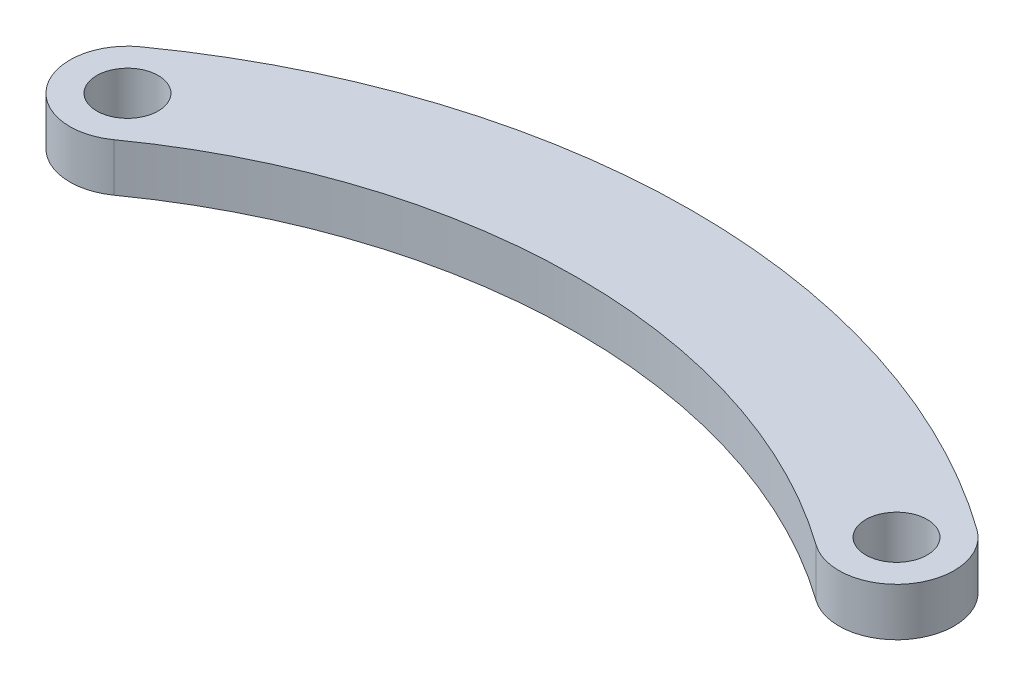
ISO-10303-21;
HEADER;
FILE_DESCRIPTION(('STEP AP214'),'2;1');
FILE_NAME('part.step','',(''),(''),'','','');
FILE_SCHEMA(('AUTOMOTIVE_DESIGN { 1 0 10303 214 1 1 1 1 }'));
ENDSEC;
DATA;
#1=APPLICATION_CONTEXT('core data for automotive mechanical design processes');
#2=APPLICATION_PROTOCOL_DEFINITION('international standard','automotive_design',2000,#1);
#3=PRODUCT_CONTEXT('',#1,'mechanical');
#4=PRODUCT('Part','Part','',(#3));
#5=PRODUCT_RELATED_PRODUCT_CATEGORY('part','',(#4));
#6=PRODUCT_DEFINITION_FORMATION('','',#4);
#7=PRODUCT_DEFINITION_CONTEXT('part definition',#1,'design');
#8=PRODUCT_DEFINITION('design','',#6,#7);
#9=PRODUCT_DEFINITION_SHAPE('','',#8);
#10=(LENGTH_UNIT() NAMED_UNIT(*) SI_UNIT(.MILLI.,.METRE.));
#11=(NAMED_UNIT(*) PLANE_ANGLE_UNIT() SI_UNIT($,.RADIAN.));
#12=(NAMED_UNIT(*) SI_UNIT($,.STERADIAN.) SOLID_ANGLE_UNIT());
#13=UNCERTAINTY_MEASURE_WITH_UNIT(LENGTH_MEASURE(1.E-05),#10,'distance_accuracy_value','');
#14=(GEOMETRIC_REPRESENTATION_CONTEXT(3) GLOBAL_UNCERTAINTY_ASSIGNED_CONTEXT((#13)) GLOBAL_UNIT_ASSIGNED_CONTEXT((#10,
#11,#12)) REPRESENTATION_CONTEXT('',''));
#15=CARTESIAN_POINT('',(0.,0.,0.));
#16=DIRECTION('',(0.,0.,1.));
#17=DIRECTION('',(1.,0.,0.));
#18=AXIS2_PLACEMENT_3D('',#15,#16,#17);
#19=CARTESIAN_POINT('',(30.,2.5,14.0285404331298));
#20=DIRECTION('',(0.,1.,0.));
#21=DIRECTION('',(0.,0.,1.));
#22=AXIS2_PLACEMENT_3D('',#19,#20,#21);
#23=PLANE('',#22);
#24=CARTESIAN_POINT('',(0.,2.5,0.));
#25=DIRECTION('',(0.,1.,0.));
#26=DIRECTION('',(0.,0.,1.));
#27=AXIS2_PLACEMENT_3D('',#24,#25,#26);
#28=CIRCLE('',#27,1.6);
#29=CARTESIAN_POINT('',(0.,2.5,1.6));
#30=VERTEX_POINT('',#29);
#31=EDGE_CURVE('E102',#30,#30,#28,.T.);
#32=ORIENTED_EDGE('',*,*,#31,.F.);
#33=EDGE_LOOP('',(#32));
#34=FACE_BOUND('',#33,.T.);
#35=CARTESIAN_POINT('',(40.,2.5,0.));
#36=DIRECTION('',(0.,1.,0.));
#37=DIRECTION('',(0.,0.,1.));
#38=AXIS2_PLACEMENT_3D('',#35,#36,#37);
#39=CIRCLE('',#38,3.);
#40=CARTESIAN_POINT('',(38.2586368677969,2.5,2.44287831088732));
#41=VERTEX_POINT('',#40);
#42=CARTESIAN_POINT('',(41.7413631322031,2.5,-2.44287831088733));
#43=VERTEX_POINT('',#42);
#44=EDGE_CURVE('E87',#41,#43,#39,.T.);
#45=ORIENTED_EDGE('',*,*,#44,.T.);
#46=CARTESIAN_POINT('',(20.,2.5,28.0570808662595));
#47=DIRECTION('',(0.,1.,0.));
#48=DIRECTION('',(0.,0.,1.));
#49=AXIS2_PLACEMENT_3D('',#46,#47,#48);
#50=CIRCLE('',#49,37.4557656530199);
#51=CARTESIAN_POINT('',(-1.74136313220313,2.5,-2.44287831088733));
#52=VERTEX_POINT('',#51);
#53=EDGE_CURVE('E82',#43,#52,#50,.T.);
#54=ORIENTED_EDGE('',*,*,#53,.T.);
#55=CARTESIAN_POINT('',(0.,2.5,0.));
#56=DIRECTION('',(0.,1.,0.));
#57=DIRECTION('',(0.,0.,1.));
#58=AXIS2_PLACEMENT_3D('',#55,#56,#57);
#59=CIRCLE('',#58,3.);
#60=CARTESIAN_POINT('',(1.74136313220313,2.5,2.44287831088731));
#61=VERTEX_POINT('',#60);
#62=EDGE_CURVE('E85',#52,#61,#59,.T.);
#63=ORIENTED_EDGE('',*,*,#62,.T.);
#64=CARTESIAN_POINT('',(20.,2.5,28.0570808662595));
#65=DIRECTION('',(0.,-1.,0.));
#66=DIRECTION('',(0.,0.,1.));
#67=AXIS2_PLACEMENT_3D('',#64,#65,#66);
#68=CIRCLE('',#67,31.4557656530199);
#69=EDGE_CURVE('E52',#61,#41,#68,.T.);
#70=ORIENTED_EDGE('',*,*,#69,.T.);
#71=EDGE_LOOP('',(#45,#54,#63,#70));
#72=FACE_BOUND('',#71,.T.);
#73=CARTESIAN_POINT('',(40.,2.5,0.));
#74=DIRECTION('',(0.,1.,0.));
#75=DIRECTION('',(0.,0.,1.));
#76=AXIS2_PLACEMENT_3D('',#73,#74,#75);
#77=CIRCLE('',#76,1.6);
#78=CARTESIAN_POINT('',(40.,2.5,1.6));
#79=VERTEX_POINT('',#78);
#80=EDGE_CURVE('E117',#79,#79,#77,.T.);
#81=ORIENTED_EDGE('',*,*,#80,.F.);
#82=EDGE_LOOP('',(#81));
#83=FACE_BOUND('',#82,.T.);
#84=ADVANCED_FACE('F35',(#34,#72,#83),#23,.T.);
#85=CARTESIAN_POINT('',(30.,0.,14.0285404331298));
#86=DIRECTION('',(0.,1.,0.));
#87=DIRECTION('',(0.,0.,1.));
#88=AXIS2_PLACEMENT_3D('',#85,#86,#87);
#89=PLANE('',#88);
#90=CARTESIAN_POINT('',(40.,0.,0.));
#91=DIRECTION('',(0.,1.,0.));
#92=DIRECTION('',(0.,0.,1.));
#93=AXIS2_PLACEMENT_3D('',#90,#91,#92);
#94=CIRCLE('',#93,3.);
#95=CARTESIAN_POINT('',(38.2586368677969,0.,2.44287831088732));
#96=VERTEX_POINT('',#95);
#97=CARTESIAN_POINT('',(41.7413631322031,0.,-2.44287831088733));
#98=VERTEX_POINT('',#97);
#99=EDGE_CURVE('E99',#96,#98,#94,.T.);
#100=ORIENTED_EDGE('',*,*,#99,.F.);
#101=CARTESIAN_POINT('',(20.,0.,28.0570808662595));
#102=DIRECTION('',(0.,-1.,0.));
#103=DIRECTION('',(0.,0.,1.));
#104=AXIS2_PLACEMENT_3D('',#101,#102,#103);
#105=CIRCLE('',#104,31.4557656530199);
#106=CARTESIAN_POINT('',(1.74136313220313,0.,2.44287831088731));
#107=VERTEX_POINT('',#106);
#108=EDGE_CURVE('E75',#107,#96,#105,.T.);
#109=ORIENTED_EDGE('',*,*,#108,.F.);
#110=CARTESIAN_POINT('',(0.,0.,0.));
#111=DIRECTION('',(0.,1.,0.));
#112=DIRECTION('',(0.,0.,1.));
#113=AXIS2_PLACEMENT_3D('',#110,#111,#112);
#114=CIRCLE('',#113,3.);
#115=CARTESIAN_POINT('',(-1.74136313220313,0.,-2.44287831088733));
#116=VERTEX_POINT('',#115);
#117=EDGE_CURVE('E69',#116,#107,#114,.T.);
#118=ORIENTED_EDGE('',*,*,#117,.F.);
#119=CARTESIAN_POINT('',(20.,0.,28.0570808662595));
#120=DIRECTION('',(0.,1.,0.));
#121=DIRECTION('',(0.,0.,1.));
#122=AXIS2_PLACEMENT_3D('',#119,#120,#121);
#123=CIRCLE('',#122,37.4557656530199);
#124=EDGE_CURVE('E91',#98,#116,#123,.T.);
#125=ORIENTED_EDGE('',*,*,#124,.F.);
#126=EDGE_LOOP('',(#100,#109,#118,#125));
#127=FACE_BOUND('',#126,.T.);
#128=CARTESIAN_POINT('',(0.,0.,0.));
#129=DIRECTION('',(0.,1.,0.));
#130=DIRECTION('',(0.,0.,1.));
#131=AXIS2_PLACEMENT_3D('',#128,#129,#130);
#132=CIRCLE('',#131,1.6);
#133=CARTESIAN_POINT('',(0.,0.,1.6));
#134=VERTEX_POINT('',#133);
#135=EDGE_CURVE('E114',#134,#134,#132,.T.);
#136=ORIENTED_EDGE('',*,*,#135,.T.);
#137=EDGE_LOOP('',(#136));
#138=FACE_BOUND('',#137,.T.);
#139=CARTESIAN_POINT('',(40.,0.,0.));
#140=DIRECTION('',(0.,1.,0.));
#141=DIRECTION('',(0.,0.,1.));
#142=AXIS2_PLACEMENT_3D('',#139,#140,#141);
#143=CIRCLE('',#142,1.6);
#144=CARTESIAN_POINT('',(40.,0.,1.6));
#145=VERTEX_POINT('',#144);
#146=EDGE_CURVE('E120',#145,#145,#143,.T.);
#147=ORIENTED_EDGE('',*,*,#146,.T.);
#148=EDGE_LOOP('',(#147));
#149=FACE_BOUND('',#148,.T.);
#150=ADVANCED_FACE('F110',(#127,#138,#149),#89,.F.);
#151=CARTESIAN_POINT('',(40.,2.5,0.));
#152=DIRECTION('',(0.,-1.,0.));
#153=DIRECTION('',(0.,0.,-1.));
#154=AXIS2_PLACEMENT_3D('',#151,#152,#153);
#155=CYLINDRICAL_SURFACE('',#154,3.);
#156=ORIENTED_EDGE('',*,*,#99,.T.);
#157=DIRECTION('',(0.,-1.,0.));
#158=VECTOR('',#157,1.);
#159=CARTESIAN_POINT('',(41.7413631322031,2.5,-2.44287831088733));
#160=LINE('',#159,#158);
#161=EDGE_CURVE('E11',#43,#98,#160,.T.);
#162=ORIENTED_EDGE('',*,*,#161,.F.);
#163=ORIENTED_EDGE('',*,*,#44,.F.);
#164=DIRECTION('',(0.,-1.,0.));
#165=VECTOR('',#164,1.);
#166=CARTESIAN_POINT('',(38.2586368677969,2.5,2.44287831088732));
#167=LINE('',#166,#165);
#168=EDGE_CURVE('E95',#41,#96,#167,.T.);
#169=ORIENTED_EDGE('',*,*,#168,.T.);
#170=EDGE_LOOP('',(#156,#162,#163,#169));
#171=FACE_BOUND('',#170,.T.);
#172=ADVANCED_FACE('F37',(#171),#155,.T.);
#173=CARTESIAN_POINT('',(20.,2.5,28.0570808662595));
#174=DIRECTION('',(0.,-1.,0.));
#175=DIRECTION('',(0.,0.,-1.));
#176=AXIS2_PLACEMENT_3D('',#173,#174,#175);
#177=CYLINDRICAL_SURFACE('',#176,37.4557656530199);
#178=ORIENTED_EDGE('',*,*,#124,.T.);
#179=DIRECTION('',(0.,-1.,0.));
#180=VECTOR('',#179,1.);
#181=CARTESIAN_POINT('',(-1.74136313220313,2.5,-2.44287831088733));
#182=LINE('',#181,#180);
#183=EDGE_CURVE('E44',#52,#116,#182,.T.);
#184=ORIENTED_EDGE('',*,*,#183,.F.);
#185=ORIENTED_EDGE('',*,*,#53,.F.);
#186=ORIENTED_EDGE('',*,*,#161,.T.);
#187=EDGE_LOOP('',(#178,#184,#185,#186));
#188=FACE_BOUND('',#187,.T.);
#189=ADVANCED_FACE('F90',(#188),#177,.T.);
#190=CARTESIAN_POINT('',(0.,2.5,0.));
#191=DIRECTION('',(0.,-1.,0.));
#192=DIRECTION('',(0.,0.,-1.));
#193=AXIS2_PLACEMENT_3D('',#190,#191,#192);
#194=CYLINDRICAL_SURFACE('',#193,3.);
#195=ORIENTED_EDGE('',*,*,#117,.T.);
#196=DIRECTION('',(0.,-1.,0.));
#197=VECTOR('',#196,1.);
#198=CARTESIAN_POINT('',(1.74136313220313,2.5,2.44287831088731));
#199=LINE('',#198,#197);
#200=EDGE_CURVE('E92',#61,#107,#199,.T.);
#201=ORIENTED_EDGE('',*,*,#200,.F.);
#202=ORIENTED_EDGE('',*,*,#62,.F.);
#203=ORIENTED_EDGE('',*,*,#183,.T.);
#204=EDGE_LOOP('',(#195,#201,#202,#203));
#205=FACE_BOUND('',#204,.T.);
#206=ADVANCED_FACE('F93',(#205),#194,.T.);
#207=CARTESIAN_POINT('',(20.,2.5,28.0570808662595));
#208=DIRECTION('',(0.,-1.,0.));
#209=DIRECTION('',(0.,0.,-1.));
#210=AXIS2_PLACEMENT_3D('',#207,#208,#209);
#211=CYLINDRICAL_SURFACE('',#210,31.4557656530199);
#212=ORIENTED_EDGE('',*,*,#108,.T.);
#213=ORIENTED_EDGE('',*,*,#168,.F.);
#214=ORIENTED_EDGE('',*,*,#69,.F.);
#215=ORIENTED_EDGE('',*,*,#200,.T.);
#216=EDGE_LOOP('',(#212,#213,#214,#215));
#217=FACE_BOUND('',#216,.T.);
#218=ADVANCED_FACE('F107',(#217),#211,.F.);
#219=CARTESIAN_POINT('',(0.,2.5,0.));
#220=DIRECTION('',(0.,-1.,0.));
#221=DIRECTION('',(0.,0.,-1.));
#222=AXIS2_PLACEMENT_3D('',#219,#220,#221);
#223=CYLINDRICAL_SURFACE('',#222,1.6);
#224=ORIENTED_EDGE('',*,*,#31,.T.);
#225=EDGE_LOOP('',(#224));
#226=FACE_BOUND('',#225,.T.);
#227=ORIENTED_EDGE('',*,*,#135,.F.);
#228=EDGE_LOOP('',(#227));
#229=FACE_BOUND('',#228,.T.);
#230=ADVANCED_FACE('F137',(#226,#229),#223,.F.);
#231=CARTESIAN_POINT('',(40.,2.5,0.));
#232=DIRECTION('',(0.,-1.,0.));
#233=DIRECTION('',(0.,0.,-1.));
#234=AXIS2_PLACEMENT_3D('',#231,#232,#233);
#235=CYLINDRICAL_SURFACE('',#234,1.6);
#236=ORIENTED_EDGE('',*,*,#80,.T.);
#237=EDGE_LOOP('',(#236));
#238=FACE_BOUND('',#237,.T.);
#239=ORIENTED_EDGE('',*,*,#146,.F.);
#240=EDGE_LOOP('',(#239));
#241=FACE_BOUND('',#240,.T.);
#242=ADVANCED_FACE('F126',(#238,#241),#235,.F.);
#243=CLOSED_SHELL('',(#84,#150,#172,#189,#206,#218,#230,#242));
#244=MANIFOLD_SOLID_BREP('B2',#243);
#245=ADVANCED_BREP_SHAPE_REPRESENTATION('',(#18,#244),#14);
#246=SHAPE_DEFINITION_REPRESENTATION(#9,#245);
ENDSEC;
END-ISO-10303-21;
